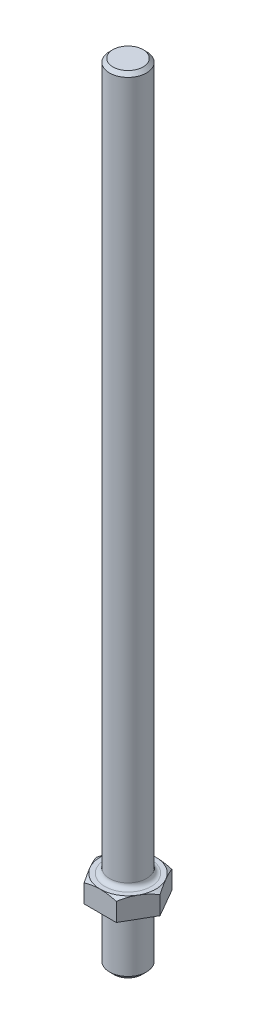
ISO-10303-21;
HEADER;
FILE_DESCRIPTION(('STEP AP214'),'2;1');
FILE_NAME('part.step','',(''),(''),'','','');
FILE_SCHEMA(('AUTOMOTIVE_DESIGN { 1 0 10303 214 1 1 1 1 }'));
ENDSEC;
DATA;
#1=APPLICATION_CONTEXT('core data for automotive mechanical design processes');
#2=APPLICATION_PROTOCOL_DEFINITION('international standard','automotive_design',2000,#1);
#3=PRODUCT_CONTEXT('',#1,'mechanical');
#4=PRODUCT('Part','Part','',(#3));
#5=PRODUCT_RELATED_PRODUCT_CATEGORY('part','',(#4));
#6=PRODUCT_DEFINITION_FORMATION('','',#4);
#7=PRODUCT_DEFINITION_CONTEXT('part definition',#1,'design');
#8=PRODUCT_DEFINITION('design','',#6,#7);
#9=PRODUCT_DEFINITION_SHAPE('','',#8);
#10=(LENGTH_UNIT() NAMED_UNIT(*) SI_UNIT(.MILLI.,.METRE.));
#11=(NAMED_UNIT(*) PLANE_ANGLE_UNIT() SI_UNIT($,.RADIAN.));
#12=(NAMED_UNIT(*) SI_UNIT($,.STERADIAN.) SOLID_ANGLE_UNIT());
#13=UNCERTAINTY_MEASURE_WITH_UNIT(LENGTH_MEASURE(1.E-05),#10,'distance_accuracy_value','');
#14=(GEOMETRIC_REPRESENTATION_CONTEXT(3) GLOBAL_UNCERTAINTY_ASSIGNED_CONTEXT((#13)) GLOBAL_UNIT_ASSIGNED_CONTEXT((#10,
#11,#12)) REPRESENTATION_CONTEXT('',''));
#15=CARTESIAN_POINT('',(0.,0.,0.));
#16=DIRECTION('',(0.,0.,1.));
#17=DIRECTION('',(1.,0.,0.));
#18=AXIS2_PLACEMENT_3D('',#15,#16,#17);
#19=CARTESIAN_POINT('',(6.92820323027551,9.,12.));
#20=DIRECTION('',(-0.866025403784439,0.,-0.5));
#21=DIRECTION('',(-0.5,0.,0.866025403784439));
#22=AXIS2_PLACEMENT_3D('',#19,#20,#21);
#23=PLANE('',#22);
#24=CARTESIAN_POINT('',(6.92808776022167,7.92813656277552,12.0002));
#25=CARTESIAN_POINT('',(7.08038456011319,8.01605036781414,11.7364142047577));
#26=CARTESIAN_POINT('',(7.23324920067831,8.09997400244333,11.4716448806182));
#27=CARTESIAN_POINT('',(7.5402043401145,8.25873378112716,10.9399829834703));
#28=CARTESIAN_POINT('',(7.69429522451414,8.33356693632642,10.6730897427069));
#29=CARTESIAN_POINT('',(8.15905073005028,8.54298246014585,9.868109594021));
#30=CARTESIAN_POINT('',(8.47155003173405,8.66209676327715,9.32684492617491));
#31=CARTESIAN_POINT('',(8.93919090681137,8.80176893899686,8.51686717084501));
#32=CARTESIAN_POINT('',(9.09293539869504,8.84155620295956,8.25057389951863));
#33=CARTESIAN_POINT('',(9.40113622968841,8.90827663078291,7.71675440130316));
#34=CARTESIAN_POINT('',(9.55559258244174,8.93520954723223,7.44922815078262));
#35=CARTESIAN_POINT('',(9.86476279544467,8.97553140808308,6.91372963367465));
#36=CARTESIAN_POINT('',(10.0194761298182,8.98893644711768,6.64575827793128));
#37=CARTESIAN_POINT('',(10.3290461538973,9.00191690624283,6.10956726772596));
#38=CARTESIAN_POINT('',(10.4839028390257,9.00149275363727,5.84134762119196));
#39=CARTESIAN_POINT('',(10.7734076259435,8.98777998065723,5.3399106212159));
#40=CARTESIAN_POINT('',(10.908076374328,8.97616401742147,5.10665750682225));
#41=CARTESIAN_POINT('',(11.1771041340893,8.94269199112762,4.64068775826923));
#42=CARTESIAN_POINT('',(11.3114631228811,8.92083520373378,4.40797116322823));
#43=CARTESIAN_POINT('',(11.5797983456356,8.86726258345709,3.94320092395705));
#44=CARTESIAN_POINT('',(11.7137741708857,8.83553860750708,3.711147987638));
#45=CARTESIAN_POINT('',(11.9810977118116,8.76278822432956,3.24813003269502));
#46=CARTESIAN_POINT('',(12.1144453841659,8.7217611848168,3.01716508910646));
#47=CARTESIAN_POINT('',(12.5192297269844,8.58368834671819,2.31605804123633));
#48=CARTESIAN_POINT('',(12.789494193517,8.47287511166067,1.84794625372147));
#49=CARTESIAN_POINT('',(13.3259930983136,8.22137423306211,0.918702892408575));
#50=CARTESIAN_POINT('',(13.5922344058351,8.08074565734061,0.457559420707842));
#51=CARTESIAN_POINT('',(13.8565219306049,7.92813656277552,-0.000200000000003557));
#52=B_SPLINE_CURVE_WITH_KNOTS('',3,(#24,#25,#26,#27,#28,#29,#30,#31,#32,#33,#34,#35,#36,#37,#38,
#39,#40,#41,#42,#43,#44,#45,#46,#47,#48,#49,#50,#51),.UNSPECIFIED.,.F.,.F.,(4,2,2,2,2,2,2,2,2,2,
2,2,2,4),(0.,0.951004872251245,1.90232158356438,3.80900466161369,4.7389455141357,
5.6689042647761,6.59775529889866,7.52657763276931,8.33514643820579,9.1437724425275,
9.95306755799766,10.7624176939264,12.4167102786892,14.0677556316691),.UNSPECIFIED.);
#53=CARTESIAN_POINT('',(6.92820323027558,7.92820323027555,12.));
#54=VERTEX_POINT('',#53);
#55=CARTESIAN_POINT('',(10.3923048454133,9.,6.));
#56=VERTEX_POINT('',#55);
#57=EDGE_CURVE('E143',#54,#56,#52,.T.);
#58=ORIENTED_EDGE('',*,*,#57,.F.);
#59=DIRECTION('',(0.,-1.,0.));
#60=VECTOR('',#59,1.);
#61=CARTESIAN_POINT('',(6.92820323027551,9.,12.));
#62=LINE('',#61,#60);
#63=CARTESIAN_POINT('',(6.92820323027551,0.,12.));
#64=VERTEX_POINT('',#63);
#65=EDGE_CURVE('E468',#54,#64,#62,.T.);
#66=ORIENTED_EDGE('',*,*,#65,.T.);
#67=DIRECTION('',(0.5,0.,-0.866025403784439));
#68=VECTOR('',#67,1.);
#69=CARTESIAN_POINT('',(6.92820323027551,0.,12.));
#70=LINE('',#69,#68);
#71=CARTESIAN_POINT('',(13.856406460551,0.,0.));
#72=VERTEX_POINT('',#71);
#73=EDGE_CURVE('E148',#64,#72,#70,.T.);
#74=ORIENTED_EDGE('',*,*,#73,.T.);
#75=DIRECTION('',(0.,-1.,0.));
#76=VECTOR('',#75,1.);
#77=CARTESIAN_POINT('',(13.856406460551,9.,0.));
#78=LINE('',#77,#76);
#79=CARTESIAN_POINT('',(13.856406460551,7.92820323027552,0.));
#80=VERTEX_POINT('',#79);
#81=EDGE_CURVE('E152',#80,#72,#78,.T.);
#82=ORIENTED_EDGE('',*,*,#81,.F.);
#83=EDGE_CURVE('E131',#56,#80,#52,.T.);
#84=ORIENTED_EDGE('',*,*,#83,.F.);
#85=EDGE_LOOP('',(#58,#66,#74,#82,#84));
#86=FACE_BOUND('',#85,.T.);
#87=ADVANCED_FACE('F48',(#86),#23,.F.);
#88=CARTESIAN_POINT('',(13.856406460551,9.,0.));
#89=DIRECTION('',(-0.866025403784439,0.,0.5));
#90=DIRECTION('',(0.5,0.,0.866025403784439));
#91=AXIS2_PLACEMENT_3D('',#88,#89,#90);
#92=PLANE('',#91);
#93=CARTESIAN_POINT('',(13.8565219306049,7.92813656277552,0.000199999999996627));
#94=CARTESIAN_POINT('',(13.7042251307133,8.01605036781414,-0.263585795242266));
#95=CARTESIAN_POINT('',(13.5513604901482,8.09997400244333,-0.528355119381804));
#96=CARTESIAN_POINT('',(13.244405350712,8.25873378112716,-1.06001701652967));
#97=CARTESIAN_POINT('',(13.0903144663124,8.33356693632641,-1.32691025729308));
#98=CARTESIAN_POINT('',(12.6255589607763,8.54298246014585,-2.13189040597901));
#99=CARTESIAN_POINT('',(12.3130596590925,8.66209676327715,-2.67315507382511));
#100=CARTESIAN_POINT('',(11.8454187840152,8.80176893899686,-3.483132829155));
#101=CARTESIAN_POINT('',(11.6916742921315,8.84155620295955,-3.74942610048138));
#102=CARTESIAN_POINT('',(11.3834734611381,8.90827663078291,-4.28324559869685));
#103=CARTESIAN_POINT('',(11.2290171083848,8.93520954723222,-4.55077184921739));
#104=CARTESIAN_POINT('',(10.9198468953819,8.97553140808308,-5.08627036632536));
#105=CARTESIAN_POINT('',(10.7651335610083,8.98893644711768,-5.35424172206874));
#106=CARTESIAN_POINT('',(10.4555635369292,9.00191690624283,-5.89043273227405));
#107=CARTESIAN_POINT('',(10.3007068518009,9.00149275363727,-6.15865237880805));
#108=CARTESIAN_POINT('',(10.0112020648831,8.98777998065723,-6.66008937878411));
#109=CARTESIAN_POINT('',(9.87653331649856,8.97616401742147,-6.89334249317776));
#110=CARTESIAN_POINT('',(9.60750555673726,8.94269199112762,-7.35931224173078));
#111=CARTESIAN_POINT('',(9.47314656794544,8.92083520373378,-7.59202883677178));
#112=CARTESIAN_POINT('',(9.2048113451909,8.86726258345709,-8.05679907604295));
#113=CARTESIAN_POINT('',(9.07083551994085,8.83553860750708,-8.28885201236201));
#114=CARTESIAN_POINT('',(8.80351197901489,8.76278822432956,-8.75186996730499));
#115=CARTESIAN_POINT('',(8.67016430666067,8.7217611848168,-8.98283491089355));
#116=CARTESIAN_POINT('',(8.26537996384211,8.58368834671819,-9.68394195876368));
#117=CARTESIAN_POINT('',(7.99511549730957,8.47287511166067,-10.1520537462785));
#118=CARTESIAN_POINT('',(7.45861659251289,8.22137423306211,-11.0812971075914));
#119=CARTESIAN_POINT('',(7.19237528499144,8.08074565734062,-11.5424405792922));
#120=CARTESIAN_POINT('',(6.92808776022168,7.92813656277552,-12.0002));
#121=B_SPLINE_CURVE_WITH_KNOTS('',3,(#93,#94,#95,#96,#97,#98,#99,#100,#101,#102,#103,#104,#105,
#106,#107,#108,#109,#110,#111,#112,#113,#114,#115,#116,#117,#118,#119,#120),.UNSPECIFIED.,.F.,
.F.,(4,2,2,2,2,2,2,2,2,2,2,2,2,4),(0.,0.951004872251246,1.90232158356438,3.80900466161369,
4.7389455141357,5.6689042647761,6.59775529889866,7.52657763276931,8.33514643820579,
9.1437724425275,9.95306755799766,10.7624176939264,12.4167102786892,14.0677556316691),.UNSPECIFIED.);
#122=CARTESIAN_POINT('',(10.3923048454133,9.,-6.00000000000001));
#123=VERTEX_POINT('',#122);
#124=EDGE_CURVE('E133',#80,#123,#121,.T.);
#125=ORIENTED_EDGE('',*,*,#124,.F.);
#126=ORIENTED_EDGE('',*,*,#81,.T.);
#127=DIRECTION('',(-0.5,0.,-0.866025403784439));
#128=VECTOR('',#127,1.);
#129=CARTESIAN_POINT('',(13.856406460551,0.,0.));
#130=LINE('',#129,#128);
#131=CARTESIAN_POINT('',(6.92820323027551,0.,-12.));
#132=VERTEX_POINT('',#131);
#133=EDGE_CURVE('E423',#72,#132,#130,.T.);
#134=ORIENTED_EDGE('',*,*,#133,.T.);
#135=DIRECTION('',(0.,-1.,0.));
#136=VECTOR('',#135,1.);
#137=CARTESIAN_POINT('',(6.92820323027551,9.,-12.));
#138=LINE('',#137,#136);
#139=CARTESIAN_POINT('',(6.92820323027551,7.92820323027551,-12.));
#140=VERTEX_POINT('',#139);
#141=EDGE_CURVE('E419',#140,#132,#138,.T.);
#142=ORIENTED_EDGE('',*,*,#141,.F.);
#143=EDGE_CURVE('E219',#123,#140,#121,.T.);
#144=ORIENTED_EDGE('',*,*,#143,.F.);
#145=EDGE_LOOP('',(#125,#126,#134,#142,#144));
#146=FACE_BOUND('',#145,.T.);
#147=ADVANCED_FACE('F233',(#146),#92,.F.);
#148=CARTESIAN_POINT('',(6.92820323027551,9.,-12.));
#149=DIRECTION('',(0.,0.,1.));
#150=DIRECTION('',(1.,0.,0.));
#151=AXIS2_PLACEMENT_3D('',#148,#149,#150);
#152=PLANE('',#151);
#153=CARTESIAN_POINT('',(23.4511148721338,0.719052599312011,-12.));
#154=CARTESIAN_POINT('',(22.9040834325755,1.00017221424734,-12.));
#155=CARTESIAN_POINT('',(22.3562460737021,1.27973740773942,-12.));
#156=CARTESIAN_POINT('',(21.258592390583,1.83497962083802,-12.));
#157=CARTESIAN_POINT('',(20.7087760283707,2.11065656534507,-12.));
#158=CARTESIAN_POINT('',(19.605908462388,2.65778340350207,-12.));
#159=CARTESIAN_POINT('',(19.0528534161768,2.92922556537542,-12.));
#160=CARTESIAN_POINT('',(17.9439367044372,3.46634509308662,-12.));
#161=CARTESIAN_POINT('',(17.3880749988182,3.73202237628975,-12.));
#162=CARTESIAN_POINT('',(16.2438766254171,4.26990948926518,-12.));
#163=CARTESIAN_POINT('',(15.6553594397968,4.54173635588283,-12.));
#164=CARTESIAN_POINT('',(14.4737964487262,5.0753203347709,-12.));
#165=CARTESIAN_POINT('',(13.8807508752518,5.33707795876587,-12.));
#166=CARTESIAN_POINT('',(12.6894870482972,5.84746724598996,-12.));
#167=CARTESIAN_POINT('',(12.091272541246,6.0961076171757,-12.));
#168=CARTESIAN_POINT('',(10.8879123456549,6.5765997047206,-12.));
#169=CARTESIAN_POINT('',(10.2827650591856,6.80844745657929,-12.));
#170=CARTESIAN_POINT('',(9.31854575768465,7.15781426700361,-12.));
#171=CARTESIAN_POINT('',(8.96214144111964,7.28267653147502,-12.));
#172=CARTESIAN_POINT('',(8.24634093787946,7.52349175100257,-12.));
#173=CARTESIAN_POINT('',(7.88694465175436,7.63944440859162,-12.));
#174=CARTESIAN_POINT('',(6.8042034047865,7.97159314022727,-12.));
#175=CARTESIAN_POINT('',(6.07587519654984,8.17223986545784,-12.));
#176=CARTESIAN_POINT('',(4.98046653545057,8.42938459078967,-12.));
#177=CARTESIAN_POINT('',(4.61835710584797,8.50724678825196,-12.));
#178=CARTESIAN_POINT('',(3.89113456201975,8.64755603590027,-12.));
#179=CARTESIAN_POINT('',(3.5260215224823,8.71000346820183,-12.));
#180=CARTESIAN_POINT('',(2.79342308434256,8.81769777030433,-12.));
#181=CARTESIAN_POINT('',(2.42593888950866,8.8629527617237,-12.));
#182=CARTESIAN_POINT('',(1.68913647346328,8.93484014411579,-12.));
#183=CARTESIAN_POINT('',(1.31981826659577,8.96147268050614,-12.));
#184=CARTESIAN_POINT('',(0.575450335386058,8.99538917226505,-12.));
#185=CARTESIAN_POINT('',(0.200388736350191,9.00241596083249,-12.));
#186=CARTESIAN_POINT('',(-0.549561456175856,8.99611762797461,-12.));
#187=CARTESIAN_POINT('',(-0.924450049484613,8.98279248525559,-12.));
#188=CARTESIAN_POINT('',(-1.67308994238322,8.93628742747006,-12.));
#189=CARTESIAN_POINT('',(-2.0468408766296,8.90310169708508,-12.));
#190=CARTESIAN_POINT('',(-2.79219700457015,8.81804993010008,-12.));
#191=CARTESIAN_POINT('',(-3.16380214589394,8.76618343951753,-12.));
#192=CARTESIAN_POINT('',(-3.91159994724779,8.6442170856841,-12.));
#193=CARTESIAN_POINT('',(-4.28773611877871,8.5737739365097,-12.));
#194=CARTESIAN_POINT('',(-5.0367301746609,8.41717287595716,-12.));
#195=CARTESIAN_POINT('',(-5.40958775265056,8.33101351202711,-12.));
#196=CARTESIAN_POINT('',(-6.1519082722025,8.14501377820946,-12.));
#197=CARTESIAN_POINT('',(-6.52137070887855,8.04517140758101,-12.));
#198=CARTESIAN_POINT('',(-7.25690241882604,7.83374244220609,-12.));
#199=CARTESIAN_POINT('',(-7.62297167255045,7.72215577985022,-12.));
#200=CARTESIAN_POINT('',(-8.33327401582776,7.49492441366584,-12.));
#201=CARTESIAN_POINT('',(-8.67766739228375,7.37977811173899,-12.));
#202=CARTESIAN_POINT('',(-9.36377770982498,7.14175269910584,-12.));
#203=CARTESIAN_POINT('',(-9.70549454481637,7.01887328359801,-12.));
#204=CARTESIAN_POINT('',(-10.3865262716006,6.76647620348883,-12.));
#205=CARTESIAN_POINT('',(-10.7258407491014,6.63695742419179,-12.));
#206=CARTESIAN_POINT('',(-11.4022490511212,6.37223564187641,-12.));
#207=CARTESIAN_POINT('',(-11.7393428144491,6.23703248297835,-12.));
#208=CARTESIAN_POINT('',(-12.7483186345413,5.82384808809453,-12.));
#209=CARTESIAN_POINT('',(-13.4172065820877,5.53855092558795,-12.));
#210=CARTESIAN_POINT('',(-14.7485014257613,4.95349964717219,-12.));
#211=CARTESIAN_POINT('',(-15.4109089281714,4.65374689952901,-12.));
#212=CARTESIAN_POINT('',(-16.6938319237068,4.06024623937219,-12.));
#213=CARTESIAN_POINT('',(-17.3146242761407,3.76709504999826,-12.));
#214=CARTESIAN_POINT('',(-18.552531562919,3.17309936579498,-12.));
#215=CARTESIAN_POINT('',(-19.1696463813168,2.87225462996669,-12.));
#216=CARTESIAN_POINT('',(-20.3989098743308,2.26542779139215,-12.));
#217=CARTESIAN_POINT('',(-21.0110680881893,1.95946498317843,-12.));
#218=CARTESIAN_POINT('',(-21.9274269780812,1.49686969878515,-12.));
#219=CARTESIAN_POINT('',(-22.2325547016638,1.34206902386015,-12.));
#220=CARTESIAN_POINT('',(-22.8422448725106,1.03136180299334,-12.));
#221=CARTESIAN_POINT('',(-23.1468073224085,0.875455262220496,-12.));
#222=CARTESIAN_POINT('',(-23.4511148721338,0.719052599312011,-12.));
#223=B_SPLINE_CURVE_WITH_KNOTS('',3,(#153,#154,#155,#156,#157,#158,#159,#160,#161,#162,#163,
#164,#165,#166,#167,#168,#169,#170,#171,#172,#173,#174,#175,#176,#177,#178,#179,#180,#181,#182,
#183,#184,#185,#186,#187,#188,#189,#190,#191,#192,#193,#194,#195,#196,#197,#198,#199,#200,#201,
#202,#203,#204,#205,#206,#207,#208,#209,#210,#211,#212,#213,#214,#215,#216,#217,#218,#219,#220,
#221,#222),.UNSPECIFIED.,.F.,.F.,(4,2,2,2,2,2,2,2,2,2,2,2,2,2,2,2,2,2,2,2,2,2,2,2,2,2,2,2,2,2,2,
2,2,2,4),(0.,1.84512066690536,3.69027692266922,5.53848006121911,7.38670967473597,
9.33141983733429,11.2760310377515,13.2193346196501,15.1630955026935,16.2959127191941,
17.4287677409028,19.693100552511,20.8039944947268,21.9148608963039,23.0252018759809,
24.1355341852138,25.2603636560478,26.3851943037628,27.510354470983,28.6355419838534,
29.7831890399153,30.9309422196453,32.0788634042365,33.2267911975288,34.3160851433029,
35.405422050641,36.4949424517247,37.5844927496589,39.7657996004199,41.9469003874126,
44.0064173416702,46.0659988891327,48.1190556796251,49.1455019600748,50.1719434459344),.UNSPECIFIED.);
#224=CARTESIAN_POINT('',(0.,9.,-12.));
#225=VERTEX_POINT('',#224);
#226=EDGE_CURVE('E226',#140,#225,#223,.T.);
#227=ORIENTED_EDGE('',*,*,#226,.F.);
#228=ORIENTED_EDGE('',*,*,#141,.T.);
#229=DIRECTION('',(-1.,0.,0.));
#230=VECTOR('',#229,1.);
#231=CARTESIAN_POINT('',(6.92820323027551,0.,-12.));
#232=LINE('',#231,#230);
#233=CARTESIAN_POINT('',(-6.92820323027552,0.,-12.));
#234=VERTEX_POINT('',#233);
#235=EDGE_CURVE('E454',#132,#234,#232,.T.);
#236=ORIENTED_EDGE('',*,*,#235,.T.);
#237=DIRECTION('',(0.,-1.,0.));
#238=VECTOR('',#237,1.);
#239=CARTESIAN_POINT('',(-6.92820323027552,9.,-12.));
#240=LINE('',#239,#238);
#241=CARTESIAN_POINT('',(-6.92820323027552,7.92820323027551,-12.));
#242=VERTEX_POINT('',#241);
#243=EDGE_CURVE('E426',#242,#234,#240,.T.);
#244=ORIENTED_EDGE('',*,*,#243,.F.);
#245=EDGE_CURVE('E179',#225,#242,#223,.T.);
#246=ORIENTED_EDGE('',*,*,#245,.F.);
#247=EDGE_LOOP('',(#227,#228,#236,#244,#246));
#248=FACE_BOUND('',#247,.T.);
#249=ADVANCED_FACE('F236',(#248),#152,.F.);
#250=CARTESIAN_POINT('',(-6.92820323027552,9.,-12.));
#251=DIRECTION('',(0.866025403784439,0.,0.5));
#252=DIRECTION('',(0.5,0.,-0.866025403784439));
#253=AXIS2_PLACEMENT_3D('',#250,#251,#252);
#254=PLANE('',#253);
#255=CARTESIAN_POINT('',(-6.92808776022168,7.92813656277552,-12.0002));
#256=CARTESIAN_POINT('',(-7.0803845601132,8.01605036781414,-11.7364142047577));
#257=CARTESIAN_POINT('',(-7.23324920067832,8.09997400244333,-11.4716448806182));
#258=CARTESIAN_POINT('',(-7.5402043401145,8.25873378112716,-10.9399829834703));
#259=CARTESIAN_POINT('',(-7.69429522451415,8.33356693632642,-10.6730897427069));
#260=CARTESIAN_POINT('',(-8.15905073005028,8.54298246014585,-9.86810959402099));
#261=CARTESIAN_POINT('',(-8.47155003173405,8.66209676327715,-9.3268449261749));
#262=CARTESIAN_POINT('',(-8.93919090681138,8.80176893899685,-8.51686717084501));
#263=CARTESIAN_POINT('',(-9.09293539869505,8.84155620295955,-8.25057389951863));
#264=CARTESIAN_POINT('',(-9.40113622968842,8.90827663078291,-7.71675440130316));
#265=CARTESIAN_POINT('',(-9.55559258244174,8.93520954723222,-7.44922815078262));
#266=CARTESIAN_POINT('',(-9.86476279544468,8.97553140808308,-6.91372963367465));
#267=CARTESIAN_POINT('',(-10.0194761298182,8.98893644711768,-6.64575827793127));
#268=CARTESIAN_POINT('',(-10.3290461538973,9.00191690624283,-6.10956726772596));
#269=CARTESIAN_POINT('',(-10.4839028390257,9.00149275363727,-5.84134762119196));
#270=CARTESIAN_POINT('',(-10.7734076259435,8.98777998065723,-5.33991062121589));
#271=CARTESIAN_POINT('',(-10.908076374328,8.97616401742147,-5.10665750682224));
#272=CARTESIAN_POINT('',(-11.1771041340893,8.94269199112762,-4.64068775826923));
#273=CARTESIAN_POINT('',(-11.3114631228811,8.92083520373378,-4.40797116322823));
#274=CARTESIAN_POINT('',(-11.5797983456356,8.86726258345709,-3.94320092395705));
#275=CARTESIAN_POINT('',(-11.7137741708857,8.83553860750707,-3.71114798763799));
#276=CARTESIAN_POINT('',(-11.9810977118116,8.76278822432956,-3.24813003269502));
#277=CARTESIAN_POINT('',(-12.1144453841659,8.7217611848168,-3.01716508910646));
#278=CARTESIAN_POINT('',(-12.5192297269844,8.5836883467182,-2.31605804123633));
#279=CARTESIAN_POINT('',(-12.789494193517,8.47287511166067,-1.84794625372147));
#280=CARTESIAN_POINT('',(-13.3259930983136,8.22137423306211,-0.918702892408575));
#281=CARTESIAN_POINT('',(-13.5922344058351,8.08074565734061,-0.457559420707844));
#282=CARTESIAN_POINT('',(-13.8565219306049,7.92813656277552,0.000200000000000469));
#283=B_SPLINE_CURVE_WITH_KNOTS('',3,(#255,#256,#257,#258,#259,#260,#261,#262,#263,#264,#265,
#266,#267,#268,#269,#270,#271,#272,#273,#274,#275,#276,#277,#278,#279,#280,#281,#282),
.UNSPECIFIED.,.F.,.F.,(4,2,2,2,2,2,2,2,2,2,2,2,2,4),(0.,0.951004872251245,1.90232158356437,
3.80900466161369,4.73894551413571,5.6689042647761,6.59775529889866,7.52657763276931,
8.33514643820579,9.1437724425275,9.95306755799766,10.7624176939264,12.4167102786892,
14.0677556316691),.UNSPECIFIED.);
#284=CARTESIAN_POINT('',(-10.3923048454133,9.,-6.));
#285=VERTEX_POINT('',#284);
#286=EDGE_CURVE('E176',#242,#285,#283,.T.);
#287=ORIENTED_EDGE('',*,*,#286,.F.);
#288=ORIENTED_EDGE('',*,*,#243,.T.);
#289=DIRECTION('',(-0.5,0.,0.866025403784439));
#290=VECTOR('',#289,1.);
#291=CARTESIAN_POINT('',(-6.92820323027552,0.,-12.));
#292=LINE('',#291,#290);
#293=CARTESIAN_POINT('',(-13.856406460551,0.,0.));
#294=VERTEX_POINT('',#293);
#295=EDGE_CURVE('E459',#234,#294,#292,.T.);
#296=ORIENTED_EDGE('',*,*,#295,.T.);
#297=DIRECTION('',(0.,-1.,0.));
#298=VECTOR('',#297,1.);
#299=CARTESIAN_POINT('',(-13.856406460551,9.,0.));
#300=LINE('',#299,#298);
#301=CARTESIAN_POINT('',(-13.856406460551,7.92820323027552,0.));
#302=VERTEX_POINT('',#301);
#303=EDGE_CURVE('E187',#302,#294,#300,.T.);
#304=ORIENTED_EDGE('',*,*,#303,.F.);
#305=EDGE_CURVE('E172',#285,#302,#283,.T.);
#306=ORIENTED_EDGE('',*,*,#305,.F.);
#307=EDGE_LOOP('',(#287,#288,#296,#304,#306));
#308=FACE_BOUND('',#307,.T.);
#309=ADVANCED_FACE('F185',(#308),#254,.F.);
#310=CARTESIAN_POINT('',(-13.856406460551,9.,0.));
#311=DIRECTION('',(0.866025403784438,0.,-0.5));
#312=DIRECTION('',(-0.5,0.,-0.866025403784438));
#313=AXIS2_PLACEMENT_3D('',#310,#311,#312);
#314=PLANE('',#313);
#315=CARTESIAN_POINT('',(-13.8565219306049,7.92813656277552,-0.000199999999998361));
#316=CARTESIAN_POINT('',(-13.7042251307133,8.01605036781414,0.263585795242263));
#317=CARTESIAN_POINT('',(-13.5513604901482,8.09997400244333,0.528355119381802));
#318=CARTESIAN_POINT('',(-13.244405350712,8.25873378112716,1.06001701652966));
#319=CARTESIAN_POINT('',(-13.0903144663124,8.33356693632642,1.32691025729307));
#320=CARTESIAN_POINT('',(-12.6255589607763,8.54298246014585,2.13189040597901));
#321=CARTESIAN_POINT('',(-12.3130596590925,8.66209676327715,2.6731550738251));
#322=CARTESIAN_POINT('',(-11.8454187840152,8.80176893899686,3.483132829155));
#323=CARTESIAN_POINT('',(-11.6916742921315,8.84155620295956,3.74942610048138));
#324=CARTESIAN_POINT('',(-11.3834734611381,8.90827663078291,4.28324559869684));
#325=CARTESIAN_POINT('',(-11.2290171083848,8.93520954723223,4.55077184921739));
#326=CARTESIAN_POINT('',(-10.9198468953819,8.97553140808308,5.08627036632535));
#327=CARTESIAN_POINT('',(-10.7651335610083,8.98893644711768,5.35424172206873));
#328=CARTESIAN_POINT('',(-10.4555635369292,9.00191690624283,5.89043273227404));
#329=CARTESIAN_POINT('',(-10.3007068518009,9.00149275363727,6.15865237880804));
#330=CARTESIAN_POINT('',(-10.0112020648831,8.98777998065723,6.66008937878411));
#331=CARTESIAN_POINT('',(-9.87653331649856,8.97616401742147,6.89334249317776));
#332=CARTESIAN_POINT('',(-9.60750555673725,8.94269199112762,7.35931224173077));
#333=CARTESIAN_POINT('',(-9.47314656794544,8.92083520373378,7.59202883677178));
#334=CARTESIAN_POINT('',(-9.2048113451909,8.86726258345709,8.05679907604295));
#335=CARTESIAN_POINT('',(-9.07083551994085,8.83553860750708,8.28885201236201));
#336=CARTESIAN_POINT('',(-8.80351197901489,8.76278822432956,8.75186996730499));
#337=CARTESIAN_POINT('',(-8.67016430666066,8.7217611848168,8.98283491089355));
#338=CARTESIAN_POINT('',(-8.2653799638421,8.5836883467182,9.68394195876367));
#339=CARTESIAN_POINT('',(-7.99511549730956,8.47287511166067,10.1520537462785));
#340=CARTESIAN_POINT('',(-7.45861659251289,8.22137423306211,11.0812971075914));
#341=CARTESIAN_POINT('',(-7.19237528499143,8.08074565734061,11.5424405792922));
#342=CARTESIAN_POINT('',(-6.92808776022167,7.92813656277552,12.0002));
#343=B_SPLINE_CURVE_WITH_KNOTS('',3,(#315,#316,#317,#318,#319,#320,#321,#322,#323,#324,#325,
#326,#327,#328,#329,#330,#331,#332,#333,#334,#335,#336,#337,#338,#339,#340,#341,#342),
.UNSPECIFIED.,.F.,.F.,(4,2,2,2,2,2,2,2,2,2,2,2,2,4),(0.,0.951004872251246,1.90232158356438,
3.80900466161369,4.73894551413571,5.6689042647761,6.59775529889866,7.52657763276931,
8.33514643820579,9.1437724425275,9.95306755799766,10.7624176939264,12.4167102786892,
14.0677556316691),.UNSPECIFIED.);
#344=CARTESIAN_POINT('',(-10.3923048454133,9.,6.00000000000001));
#345=VERTEX_POINT('',#344);
#346=EDGE_CURVE('E161',#302,#345,#343,.T.);
#347=ORIENTED_EDGE('',*,*,#346,.F.);
#348=ORIENTED_EDGE('',*,*,#303,.T.);
#349=DIRECTION('',(0.5,0.,0.866025403784438));
#350=VECTOR('',#349,1.);
#351=CARTESIAN_POINT('',(-13.856406460551,0.,0.));
#352=LINE('',#351,#350);
#353=CARTESIAN_POINT('',(-6.92820323027551,0.,12.));
#354=VERTEX_POINT('',#353);
#355=EDGE_CURVE('E462',#294,#354,#352,.T.);
#356=ORIENTED_EDGE('',*,*,#355,.T.);
#357=DIRECTION('',(0.,-1.,0.));
#358=VECTOR('',#357,1.);
#359=CARTESIAN_POINT('',(-6.92820323027551,9.,12.));
#360=LINE('',#359,#358);
#361=CARTESIAN_POINT('',(-6.92820323027551,7.92820323027552,12.));
#362=VERTEX_POINT('',#361);
#363=EDGE_CURVE('E471',#362,#354,#360,.T.);
#364=ORIENTED_EDGE('',*,*,#363,.F.);
#365=EDGE_CURVE('E159',#345,#362,#343,.T.);
#366=ORIENTED_EDGE('',*,*,#365,.F.);
#367=EDGE_LOOP('',(#347,#348,#356,#364,#366));
#368=FACE_BOUND('',#367,.T.);
#369=ADVANCED_FACE('F378',(#368),#314,.F.);
#370=CARTESIAN_POINT('',(-6.92820323027551,9.,12.));
#371=DIRECTION('',(0.,0.,-1.));
#372=DIRECTION('',(-1.,0.,0.));
#373=AXIS2_PLACEMENT_3D('',#370,#371,#372);
#374=PLANE('',#373);
#375=CARTESIAN_POINT('',(-23.4511148721338,0.71905259931202,12.));
#376=CARTESIAN_POINT('',(-22.9040834325755,1.00017221424735,12.));
#377=CARTESIAN_POINT('',(-22.3562460737021,1.27973740773943,12.));
#378=CARTESIAN_POINT('',(-21.258592390583,1.83497962083803,12.));
#379=CARTESIAN_POINT('',(-20.7087760283707,2.11065656534508,12.));
#380=CARTESIAN_POINT('',(-19.605908462388,2.65778340350207,12.));
#381=CARTESIAN_POINT('',(-19.0528534161768,2.92922556537543,12.));
#382=CARTESIAN_POINT('',(-17.9439367044372,3.46634509308662,12.));
#383=CARTESIAN_POINT('',(-17.3880749988182,3.73202237628975,12.));
#384=CARTESIAN_POINT('',(-16.2438766254171,4.26990948926518,12.));
#385=CARTESIAN_POINT('',(-15.6553594397968,4.54173635588284,12.));
#386=CARTESIAN_POINT('',(-14.4737964487262,5.0753203347709,12.));
#387=CARTESIAN_POINT('',(-13.8807508752518,5.33707795876587,12.));
#388=CARTESIAN_POINT('',(-12.6894870482972,5.84746724598996,12.));
#389=CARTESIAN_POINT('',(-12.091272541246,6.09610761717571,12.));
#390=CARTESIAN_POINT('',(-10.8879123456549,6.57659970472061,12.));
#391=CARTESIAN_POINT('',(-10.2827650591856,6.80844745657929,12.));
#392=CARTESIAN_POINT('',(-9.31854575768465,7.15781426700361,12.));
#393=CARTESIAN_POINT('',(-8.96214144111963,7.28267653147502,12.));
#394=CARTESIAN_POINT('',(-8.24634093787946,7.52349175100257,12.));
#395=CARTESIAN_POINT('',(-7.88694465175435,7.63944440859162,12.));
#396=CARTESIAN_POINT('',(-6.80420340478649,7.97159314022727,12.));
#397=CARTESIAN_POINT('',(-6.07587519654983,8.17223986545785,12.));
#398=CARTESIAN_POINT('',(-4.98046653545056,8.42938459078967,12.));
#399=CARTESIAN_POINT('',(-4.61835710584796,8.50724678825197,12.));
#400=CARTESIAN_POINT('',(-3.89113456201974,8.64755603590027,12.));
#401=CARTESIAN_POINT('',(-3.52602152248229,8.71000346820183,12.));
#402=CARTESIAN_POINT('',(-2.79342308434255,8.81769777030433,12.));
#403=CARTESIAN_POINT('',(-2.42593888950866,8.8629527617237,12.));
#404=CARTESIAN_POINT('',(-1.68913647346328,8.93484014411579,12.));
#405=CARTESIAN_POINT('',(-1.31981826659576,8.96147268050615,12.));
#406=CARTESIAN_POINT('',(-0.575450335386052,8.99538917226505,12.));
#407=CARTESIAN_POINT('',(-0.200388736350185,9.00241596083249,12.));
#408=CARTESIAN_POINT('',(0.549561456175861,8.99611762797461,12.));
#409=CARTESIAN_POINT('',(0.924450049484618,8.98279248525559,12.));
#410=CARTESIAN_POINT('',(1.67308994238322,8.93628742747006,12.));
#411=CARTESIAN_POINT('',(2.0468408766296,8.90310169708508,12.));
#412=CARTESIAN_POINT('',(2.79219700457015,8.81804993010008,12.));
#413=CARTESIAN_POINT('',(3.16380214589394,8.76618343951753,12.));
#414=CARTESIAN_POINT('',(3.9115999472478,8.6442170856841,12.));
#415=CARTESIAN_POINT('',(4.28773611877871,8.5737739365097,12.));
#416=CARTESIAN_POINT('',(5.03673017466091,8.41717287595716,12.));
#417=CARTESIAN_POINT('',(5.40958775265057,8.3310135120271,12.));
#418=CARTESIAN_POINT('',(6.1519082722025,8.14501377820945,12.));
#419=CARTESIAN_POINT('',(6.52137070887855,8.04517140758101,12.));
#420=CARTESIAN_POINT('',(7.25690241882605,7.83374244220609,12.));
#421=CARTESIAN_POINT('',(7.62297167255045,7.72215577985021,12.));
#422=CARTESIAN_POINT('',(8.33327401582777,7.49492441366584,12.));
#423=CARTESIAN_POINT('',(8.67766739228375,7.37977811173899,12.));
#424=CARTESIAN_POINT('',(9.36377770982498,7.14175269910583,12.));
#425=CARTESIAN_POINT('',(9.70549454481637,7.01887328359801,12.));
#426=CARTESIAN_POINT('',(10.3865262716006,6.76647620348883,12.));
#427=CARTESIAN_POINT('',(10.7258407491014,6.63695742419179,12.));
#428=CARTESIAN_POINT('',(11.4022490511212,6.37223564187641,12.));
#429=CARTESIAN_POINT('',(11.7393428144491,6.23703248297834,12.));
#430=CARTESIAN_POINT('',(12.7483186345413,5.82384808809452,12.));
#431=CARTESIAN_POINT('',(13.4172065820877,5.53855092558795,12.));
#432=CARTESIAN_POINT('',(14.7485014257613,4.95349964717218,12.));
#433=CARTESIAN_POINT('',(15.4109089281714,4.653746899529,12.));
#434=CARTESIAN_POINT('',(16.6938319237068,4.06024623937219,12.));
#435=CARTESIAN_POINT('',(17.3146242761407,3.76709504999826,12.));
#436=CARTESIAN_POINT('',(18.552531562919,3.17309936579498,12.));
#437=CARTESIAN_POINT('',(19.1696463813168,2.87225462996669,12.));
#438=CARTESIAN_POINT('',(20.3989098743308,2.26542779139215,12.));
#439=CARTESIAN_POINT('',(21.0110680881893,1.95946498317843,12.));
#440=CARTESIAN_POINT('',(21.9274269780812,1.49686969878516,12.));
#441=CARTESIAN_POINT('',(22.2325547016638,1.34206902386015,12.));
#442=CARTESIAN_POINT('',(22.8422448725106,1.03136180299334,12.));
#443=CARTESIAN_POINT('',(23.1468073224085,0.875455262220499,12.));
#444=CARTESIAN_POINT('',(23.4511148721338,0.719052599312015,12.));
#445=B_SPLINE_CURVE_WITH_KNOTS('',3,(#375,#376,#377,#378,#379,#380,#381,#382,#383,#384,#385,
#386,#387,#388,#389,#390,#391,#392,#393,#394,#395,#396,#397,#398,#399,#400,#401,#402,#403,#404,
#405,#406,#407,#408,#409,#410,#411,#412,#413,#414,#415,#416,#417,#418,#419,#420,#421,#422,#423,
#424,#425,#426,#427,#428,#429,#430,#431,#432,#433,#434,#435,#436,#437,#438,#439,#440,#441,#442,
#443,#444),.UNSPECIFIED.,.F.,.F.,(4,2,2,2,2,2,2,2,2,2,2,2,2,2,2,2,2,2,2,2,2,2,2,2,2,2,2,2,2,2,2,
2,2,2,4),(0.,1.84512066690535,3.69027692266921,5.5384800612191,7.38670967473596,
9.33141983733428,11.2760310377515,13.21933461965,15.1630955026935,16.2959127191941,
17.4287677409028,19.693100552511,20.8039944947268,21.9148608963039,23.0252018759809,
24.1355341852138,25.2603636560478,26.3851943037628,27.510354470983,28.6355419838534,
29.7831890399153,30.9309422196452,32.0788634042364,33.2267911975287,34.3160851433029,
35.405422050641,36.4949424517247,37.5844927496589,39.7657996004199,41.9469003874126,
44.0064173416702,46.0659988891327,48.1190556796251,49.1455019600748,50.1719434459344),.UNSPECIFIED.);
#446=CARTESIAN_POINT('',(0.,9.,12.));
#447=VERTEX_POINT('',#446);
#448=EDGE_CURVE('E13',#362,#447,#445,.T.);
#449=ORIENTED_EDGE('',*,*,#448,.F.);
#450=ORIENTED_EDGE('',*,*,#363,.T.);
#451=DIRECTION('',(1.,0.,0.));
#452=VECTOR('',#451,1.);
#453=CARTESIAN_POINT('',(-6.92820323027551,0.,12.));
#454=LINE('',#453,#452);
#455=EDGE_CURVE('E451',#354,#64,#454,.T.);
#456=ORIENTED_EDGE('',*,*,#455,.T.);
#457=ORIENTED_EDGE('',*,*,#65,.F.);
#458=EDGE_CURVE('E53',#447,#54,#445,.T.);
#459=ORIENTED_EDGE('',*,*,#458,.F.);
#460=EDGE_LOOP('',(#449,#450,#456,#457,#459));
#461=FACE_BOUND('',#460,.T.);
#462=ADVANCED_FACE('F373',(#461),#374,.F.);
#463=CARTESIAN_POINT('',(0.,0.,0.));
#464=DIRECTION('',(0.,1.,0.));
#465=DIRECTION('',(0.,0.,1.));
#466=AXIS2_PLACEMENT_3D('',#463,#464,#465);
#467=PLANE('',#466);
#468=CARTESIAN_POINT('',(0.,0.,0.));
#469=DIRECTION('',(0.,1.,0.));
#470=DIRECTION('',(0.,0.,1.));
#471=AXIS2_PLACEMENT_3D('',#468,#469,#470);
#472=CIRCLE('',#471,10.);
#473=CARTESIAN_POINT('',(0.,0.,10.));
#474=VERTEX_POINT('',#473);
#475=EDGE_CURVE('E286',#474,#474,#472,.T.);
#476=ORIENTED_EDGE('',*,*,#475,.T.);
#477=EDGE_LOOP('',(#476));
#478=FACE_BOUND('',#477,.T.);
#479=ORIENTED_EDGE('',*,*,#73,.F.);
#480=ORIENTED_EDGE('',*,*,#455,.F.);
#481=ORIENTED_EDGE('',*,*,#355,.F.);
#482=ORIENTED_EDGE('',*,*,#295,.F.);
#483=ORIENTED_EDGE('',*,*,#235,.F.);
#484=ORIENTED_EDGE('',*,*,#133,.F.);
#485=EDGE_LOOP('',(#479,#480,#481,#482,#483,#484));
#486=FACE_BOUND('',#485,.T.);
#487=ADVANCED_FACE('F250',(#478,#486),#467,.F.);
#488=CARTESIAN_POINT('',(0.,-26.,0.));
#489=DIRECTION('',(0.,1.,0.));
#490=DIRECTION('',(0.,0.,1.));
#491=AXIS2_PLACEMENT_3D('',#488,#489,#490);
#492=PLANE('',#491);
#493=CARTESIAN_POINT('',(0.,-26.,0.));
#494=DIRECTION('',(0.,1.,0.));
#495=DIRECTION('',(0.,0.,1.));
#496=AXIS2_PLACEMENT_3D('',#493,#494,#495);
#497=CIRCLE('',#496,5.99999999999984);
#498=CARTESIAN_POINT('',(0.,-26.,5.99999999999984));
#499=VERTEX_POINT('',#498);
#500=EDGE_CURVE('E273',#499,#499,#497,.F.);
#501=ORIENTED_EDGE('',*,*,#500,.T.);
#502=EDGE_LOOP('',(#501));
#503=FACE_BOUND('',#502,.T.);
#504=ADVANCED_FACE('F246',(#503),#492,.F.);
#505=CARTESIAN_POINT('',(0.,-26.,0.));
#506=DIRECTION('',(0.,1.,0.));
#507=DIRECTION('',(0.,0.,1.));
#508=AXIS2_PLACEMENT_3D('',#505,#506,#507);
#509=CYLINDRICAL_SURFACE('',#508,8.);
#510=CARTESIAN_POINT('',(0.,-23.9999999999998,0.));
#511=DIRECTION('',(0.,1.,0.));
#512=DIRECTION('',(0.,0.,1.));
#513=AXIS2_PLACEMENT_3D('',#510,#511,#512);
#514=CIRCLE('',#513,8.);
#515=CARTESIAN_POINT('',(0.,-23.9999999999998,8.));
#516=VERTEX_POINT('',#515);
#517=EDGE_CURVE('E276',#516,#516,#514,.T.);
#518=CARTESIAN_POINT('',(0.,-2.,0.));
#519=DIRECTION('',(0.,1.,0.));
#520=DIRECTION('',(0.,0.,1.));
#521=AXIS2_PLACEMENT_3D('',#518,#519,#520);
#522=CIRCLE('',#521,8.);
#523=CARTESIAN_POINT('',(0.,-2.,8.));
#524=VERTEX_POINT('',#523);
#525=EDGE_CURVE('E279',#524,#524,#522,.F.);
#526=CARTESIAN_POINT('',(0.,-23.9999999999998,8.));
#527=CARTESIAN_POINT('',(0.,-23.7708333333332,8.));
#528=CARTESIAN_POINT('',(0.,-23.5416666666665,8.));
#529=CARTESIAN_POINT('',(0.,-23.0833333333332,8.));
#530=CARTESIAN_POINT('',(0.,-22.8541666666665,8.));
#531=CARTESIAN_POINT('',(0.,-22.3958333333332,8.));
#532=CARTESIAN_POINT('',(0.,-22.1666666666665,8.));
#533=CARTESIAN_POINT('',(0.,-21.7083333333332,8.));
#534=CARTESIAN_POINT('',(0.,-21.4791666666665,8.));
#535=CARTESIAN_POINT('',(0.,-21.0208333333332,8.));
#536=CARTESIAN_POINT('',(0.,-20.7916666666665,8.));
#537=CARTESIAN_POINT('',(0.,-20.3333333333332,8.));
#538=CARTESIAN_POINT('',(0.,-20.1041666666665,8.));
#539=CARTESIAN_POINT('',(0.,-19.6458333333332,8.));
#540=CARTESIAN_POINT('',(0.,-19.4166666666665,8.));
#541=CARTESIAN_POINT('',(0.,-18.9583333333332,8.));
#542=CARTESIAN_POINT('',(0.,-18.7291666666665,8.));
#543=CARTESIAN_POINT('',(0.,-18.2708333333332,8.));
#544=CARTESIAN_POINT('',(0.,-18.0416666666666,8.));
#545=CARTESIAN_POINT('',(0.,-17.5833333333332,8.));
#546=CARTESIAN_POINT('',(0.,-17.3541666666666,8.));
#547=CARTESIAN_POINT('',(0.,-16.8958333333332,8.));
#548=CARTESIAN_POINT('',(0.,-16.6666666666666,8.));
#549=CARTESIAN_POINT('',(0.,-16.2083333333332,8.));
#550=CARTESIAN_POINT('',(0.,-15.9791666666666,8.));
#551=CARTESIAN_POINT('',(0.,-15.5208333333332,8.));
#552=CARTESIAN_POINT('',(0.,-15.2916666666666,8.));
#553=CARTESIAN_POINT('',(0.,-14.8333333333332,8.));
#554=CARTESIAN_POINT('',(0.,-14.6041666666666,8.));
#555=CARTESIAN_POINT('',(0.,-14.1458333333332,8.));
#556=CARTESIAN_POINT('',(0.,-13.9166666666666,8.));
#557=CARTESIAN_POINT('',(0.,-13.4583333333333,8.));
#558=CARTESIAN_POINT('',(0.,-13.2291666666666,8.));
#559=CARTESIAN_POINT('',(0.,-12.7708333333333,8.));
#560=CARTESIAN_POINT('',(0.,-12.5416666666666,8.));
#561=CARTESIAN_POINT('',(0.,-12.0833333333333,8.));
#562=CARTESIAN_POINT('',(0.,-11.8541666666666,8.));
#563=CARTESIAN_POINT('',(0.,-11.3958333333333,8.));
#564=CARTESIAN_POINT('',(0.,-11.1666666666666,8.));
#565=CARTESIAN_POINT('',(0.,-10.7083333333333,8.));
#566=CARTESIAN_POINT('',(0.,-10.4791666666666,8.));
#567=CARTESIAN_POINT('',(0.,-10.0208333333333,8.));
#568=CARTESIAN_POINT('',(0.,-9.79166666666661,8.));
#569=CARTESIAN_POINT('',(0.,-9.33333333333328,8.));
#570=CARTESIAN_POINT('',(0.,-9.10416666666662,8.));
#571=CARTESIAN_POINT('',(0.,-8.64583333333329,8.));
#572=CARTESIAN_POINT('',(0.,-8.41666666666662,8.));
#573=CARTESIAN_POINT('',(0.,-7.95833333333329,8.));
#574=CARTESIAN_POINT('',(0.,-7.72916666666663,8.));
#575=CARTESIAN_POINT('',(0.,-7.2708333333333,8.));
#576=CARTESIAN_POINT('',(0.,-7.04166666666663,8.));
#577=CARTESIAN_POINT('',(0.,-6.5833333333333,8.));
#578=CARTESIAN_POINT('',(0.,-6.35416666666664,8.));
#579=CARTESIAN_POINT('',(0.,-5.89583333333331,8.));
#580=CARTESIAN_POINT('',(0.,-5.66666666666664,8.));
#581=CARTESIAN_POINT('',(0.,-5.20833333333331,8.));
#582=CARTESIAN_POINT('',(0.,-4.97916666666665,8.));
#583=CARTESIAN_POINT('',(0.,-4.52083333333332,8.));
#584=CARTESIAN_POINT('',(0.,-4.29166666666665,8.));
#585=CARTESIAN_POINT('',(0.,-3.83333333333332,8.));
#586=CARTESIAN_POINT('',(0.,-3.60416666666666,8.));
#587=CARTESIAN_POINT('',(0.,-3.14583333333333,8.));
#588=CARTESIAN_POINT('',(0.,-2.91666666666666,8.));
#589=CARTESIAN_POINT('',(0.,-2.45833333333333,8.));
#590=CARTESIAN_POINT('',(0.,-2.22916666666667,8.));
#591=CARTESIAN_POINT('',(0.,-2.,8.));
#592=B_SPLINE_CURVE_WITH_KNOTS('',3,(#526,#527,#528,#529,#530,#531,#532,#533,#534,#535,#536,
#537,#538,#539,#540,#541,#542,#543,#544,#545,#546,#547,#548,#549,#550,#551,#552,#553,#554,#555,
#556,#557,#558,#559,#560,#561,#562,#563,#564,#565,#566,#567,#568,#569,#570,#571,#572,#573,#574,
#575,#576,#577,#578,#579,#580,#581,#582,#583,#584,#585,#586,#587,#588,#589,#590,#591),
.UNSPECIFIED.,.F.,.F.,(4,2,2,2,2,2,2,2,2,2,2,2,2,2,2,2,2,2,2,2,2,2,2,2,2,2,2,2,2,2,2,2,4),(0.,
0.687499999999994,1.37499999999999,2.06249999999998,2.74999999999998,3.43749999999997,
4.12499999999997,4.81249999999996,5.49999999999996,6.18749999999995,6.87499999999995,
7.56249999999994,8.24999999999993,8.93749999999993,9.62499999999993,10.3124999999999,
10.9999999999999,11.6874999999999,12.3749999999999,13.0624999999999,13.7499999999999,
14.4374999999999,15.1249999999999,15.8124999999999,16.4999999999999,17.1874999999999,
17.8749999999999,18.5624999999999,19.2499999999999,19.9374999999999,20.6249999999998,
21.3124999999998,21.9999999999998),.UNSPECIFIED.);
#593=EDGE_CURVE('BSEAM249',#516,#524,#592,.T.);
#594=ORIENTED_EDGE('',*,*,#517,.T.);
#595=ORIENTED_EDGE('',*,*,#525,.T.);
#596=ORIENTED_EDGE('',*,*,#593,.T.);
#597=ORIENTED_EDGE('',*,*,#593,.F.);
#598=EDGE_LOOP('',(#594,#596,#595,#597));
#599=FACE_BOUND('',#598,.T.);
#600=ADVANCED_FACE('F249',(#599),#509,.T.);
#601=CARTESIAN_POINT('',(0.,-2.,0.));
#602=DIRECTION('',(0.,1.,0.));
#603=DIRECTION('',(0.,0.,1.));
#604=AXIS2_PLACEMENT_3D('',#601,#602,#603);
#605=TOROIDAL_SURFACE('',#604,10.,2.);
#606=ORIENTED_EDGE('',*,*,#525,.F.);
#607=EDGE_LOOP('',(#606));
#608=FACE_BOUND('',#607,.T.);
#609=ORIENTED_EDGE('',*,*,#475,.F.);
#610=EDGE_LOOP('',(#609));
#611=FACE_BOUND('',#610,.T.);
#612=ADVANCED_FACE('F260',(#608,#611),#605,.F.);
#613=CARTESIAN_POINT('',(0.,-23.9999999999998,0.));
#614=DIRECTION('',(0.,1.,0.));
#615=DIRECTION('',(0.,0.,1.));
#616=AXIS2_PLACEMENT_3D('',#613,#614,#615);
#617=CONICAL_SURFACE('',#616,8.,0.785398163397449);
#618=ORIENTED_EDGE('',*,*,#500,.F.);
#619=EDGE_LOOP('',(#618));
#620=FACE_BOUND('',#619,.T.);
#621=ORIENTED_EDGE('',*,*,#517,.F.);
#622=EDGE_LOOP('',(#621));
#623=FACE_BOUND('',#622,.T.);
#624=ADVANCED_FACE('F212',(#620,#623),#617,.T.);
#625=CARTESIAN_POINT('',(0.,9.,0.));
#626=DIRECTION('',(0.,-1.,0.));
#627=DIRECTION('',(0.,0.,1.));
#628=AXIS2_PLACEMENT_3D('',#625,#626,#627);
#629=CONICAL_SURFACE('',#628,12.,1.0471975511966);
#630=ORIENTED_EDGE('',*,*,#57,.T.);
#631=CARTESIAN_POINT('',(0.,9.,0.));
#632=DIRECTION('',(0.,1.,0.));
#633=DIRECTION('',(0.,0.,1.));
#634=AXIS2_PLACEMENT_3D('',#631,#632,#633);
#635=CIRCLE('',#634,12.);
#636=EDGE_CURVE('E138',#447,#56,#635,.T.);
#637=ORIENTED_EDGE('',*,*,#636,.F.);
#638=ORIENTED_EDGE('',*,*,#458,.T.);
#639=EDGE_LOOP('',(#630,#637,#638));
#640=FACE_BOUND('',#639,.T.);
#641=ADVANCED_FACE('F144',(#640),#629,.T.);
#642=ORIENTED_EDGE('',*,*,#365,.T.);
#643=ORIENTED_EDGE('',*,*,#448,.T.);
#644=EDGE_CURVE('E157',#345,#447,#635,.T.);
#645=ORIENTED_EDGE('',*,*,#644,.F.);
#646=EDGE_LOOP('',(#642,#643,#645));
#647=FACE_BOUND('',#646,.T.);
#648=ADVANCED_FACE('F211',(#647),#629,.T.);
#649=ORIENTED_EDGE('',*,*,#305,.T.);
#650=ORIENTED_EDGE('',*,*,#346,.T.);
#651=EDGE_CURVE('E164',#285,#345,#635,.T.);
#652=ORIENTED_EDGE('',*,*,#651,.F.);
#653=EDGE_LOOP('',(#649,#650,#652));
#654=FACE_BOUND('',#653,.T.);
#655=ADVANCED_FACE('F170',(#654),#629,.T.);
#656=ORIENTED_EDGE('',*,*,#245,.T.);
#657=ORIENTED_EDGE('',*,*,#286,.T.);
#658=EDGE_CURVE('E79',#225,#285,#635,.T.);
#659=ORIENTED_EDGE('',*,*,#658,.F.);
#660=EDGE_LOOP('',(#656,#657,#659));
#661=FACE_BOUND('',#660,.T.);
#662=ADVANCED_FACE('F177',(#661),#629,.T.);
#663=ORIENTED_EDGE('',*,*,#143,.T.);
#664=ORIENTED_EDGE('',*,*,#226,.T.);
#665=EDGE_CURVE('E71',#123,#225,#635,.T.);
#666=ORIENTED_EDGE('',*,*,#665,.F.);
#667=EDGE_LOOP('',(#663,#664,#666));
#668=FACE_BOUND('',#667,.T.);
#669=ADVANCED_FACE('F335',(#668),#629,.T.);
#670=ORIENTED_EDGE('',*,*,#83,.T.);
#671=ORIENTED_EDGE('',*,*,#124,.T.);
#672=EDGE_CURVE('E127',#56,#123,#635,.T.);
#673=ORIENTED_EDGE('',*,*,#672,.F.);
#674=EDGE_LOOP('',(#670,#671,#673));
#675=FACE_BOUND('',#674,.T.);
#676=ADVANCED_FACE('F129',(#675),#629,.T.);
#677=CARTESIAN_POINT('',(0.,314.,0.));
#678=DIRECTION('',(0.,1.,0.));
#679=DIRECTION('',(0.,0.,1.));
#680=AXIS2_PLACEMENT_3D('',#677,#678,#679);
#681=PLANE('',#680);
#682=CARTESIAN_POINT('',(0.,314.,0.));
#683=DIRECTION('',(0.,1.,0.));
#684=DIRECTION('',(0.,0.,1.));
#685=AXIS2_PLACEMENT_3D('',#682,#683,#684);
#686=CIRCLE('',#685,6.50000000000003);
#687=CARTESIAN_POINT('',(0.,314.,6.50000000000003));
#688=VERTEX_POINT('',#687);
#689=EDGE_CURVE('E283',#688,#688,#686,.T.);
#690=ORIENTED_EDGE('',*,*,#689,.T.);
#691=EDGE_LOOP('',(#690));
#692=FACE_BOUND('',#691,.T.);
#693=ADVANCED_FACE('F242',(#692),#681,.T.);
#694=CARTESIAN_POINT('',(0.,314.,0.));
#695=DIRECTION('',(0.,-1.,0.));
#696=DIRECTION('',(0.,0.,-1.));
#697=AXIS2_PLACEMENT_3D('',#694,#695,#696);
#698=CONICAL_SURFACE('',#697,6.50000000000003,0.785398163397493);
#699=CARTESIAN_POINT('',(0.,312.5,0.));
#700=DIRECTION('',(0.,1.,0.));
#701=DIRECTION('',(0.,0.,1.));
#702=AXIS2_PLACEMENT_3D('',#699,#700,#701);
#703=CIRCLE('',#702,8.);
#704=CARTESIAN_POINT('',(0.,312.5,8.));
#705=VERTEX_POINT('',#704);
#706=EDGE_CURVE('E292',#705,#705,#703,.F.);
#707=ORIENTED_EDGE('',*,*,#706,.F.);
#708=EDGE_LOOP('',(#707));
#709=FACE_BOUND('',#708,.T.);
#710=ORIENTED_EDGE('',*,*,#689,.F.);
#711=EDGE_LOOP('',(#710));
#712=FACE_BOUND('',#711,.T.);
#713=ADVANCED_FACE('F51',(#709,#712),#698,.T.);
#714=CARTESIAN_POINT('',(0.,11.,0.));
#715=DIRECTION('',(0.,1.,0.));
#716=DIRECTION('',(0.,0.,1.));
#717=AXIS2_PLACEMENT_3D('',#714,#715,#716);
#718=CIRCLE('',#717,8.);
#719=CARTESIAN_POINT('',(0.,11.,8.));
#720=VERTEX_POINT('',#719);
#721=EDGE_CURVE('E438',#720,#720,#718,.T.);
#722=CARTESIAN_POINT('',(0.,312.5,8.));
#723=CARTESIAN_POINT('',(0.,309.359375,8.));
#724=CARTESIAN_POINT('',(0.,306.21875,8.));
#725=CARTESIAN_POINT('',(0.,299.9375,8.));
#726=CARTESIAN_POINT('',(0.,296.796875,8.));
#727=CARTESIAN_POINT('',(0.,290.515625,8.));
#728=CARTESIAN_POINT('',(0.,287.375,8.));
#729=CARTESIAN_POINT('',(0.,281.09375,8.));
#730=CARTESIAN_POINT('',(0.,277.953125,8.));
#731=CARTESIAN_POINT('',(0.,271.671875,8.));
#732=CARTESIAN_POINT('',(0.,268.53125,8.));
#733=CARTESIAN_POINT('',(0.,262.25,8.));
#734=CARTESIAN_POINT('',(0.,259.109375,8.));
#735=CARTESIAN_POINT('',(0.,252.828125,8.));
#736=CARTESIAN_POINT('',(0.,249.6875,8.));
#737=CARTESIAN_POINT('',(0.,243.40625,8.));
#738=CARTESIAN_POINT('',(0.,240.265625,8.));
#739=CARTESIAN_POINT('',(0.,233.984375,8.));
#740=CARTESIAN_POINT('',(0.,230.84375,8.));
#741=CARTESIAN_POINT('',(0.,224.5625,8.));
#742=CARTESIAN_POINT('',(0.,221.421875,8.));
#743=CARTESIAN_POINT('',(0.,215.140625,8.));
#744=CARTESIAN_POINT('',(0.,212.,8.));
#745=CARTESIAN_POINT('',(0.,205.71875,8.));
#746=CARTESIAN_POINT('',(0.,202.578125,8.));
#747=CARTESIAN_POINT('',(0.,196.296875,8.));
#748=CARTESIAN_POINT('',(0.,193.15625,8.));
#749=CARTESIAN_POINT('',(0.,186.875,8.));
#750=CARTESIAN_POINT('',(0.,183.734375,8.));
#751=CARTESIAN_POINT('',(0.,177.453125,8.));
#752=CARTESIAN_POINT('',(0.,174.3125,8.));
#753=CARTESIAN_POINT('',(0.,168.03125,8.));
#754=CARTESIAN_POINT('',(0.,164.890625,8.));
#755=CARTESIAN_POINT('',(0.,158.609375,8.));
#756=CARTESIAN_POINT('',(0.,155.46875,8.));
#757=CARTESIAN_POINT('',(0.,149.1875,8.));
#758=CARTESIAN_POINT('',(0.,146.046875,8.));
#759=CARTESIAN_POINT('',(0.,139.765625,8.));
#760=CARTESIAN_POINT('',(0.,136.625,8.));
#761=CARTESIAN_POINT('',(0.,130.34375,8.));
#762=CARTESIAN_POINT('',(0.,127.203125,8.));
#763=CARTESIAN_POINT('',(0.,120.921875,8.));
#764=CARTESIAN_POINT('',(0.,117.78125,8.));
#765=CARTESIAN_POINT('',(0.,111.5,8.));
#766=CARTESIAN_POINT('',(0.,108.359375,8.));
#767=CARTESIAN_POINT('',(0.,102.078125,8.));
#768=CARTESIAN_POINT('',(0.,98.9375,8.));
#769=CARTESIAN_POINT('',(0.,92.6562500000001,8.));
#770=CARTESIAN_POINT('',(0.,89.515625,8.));
#771=CARTESIAN_POINT('',(0.,83.234375,8.));
#772=CARTESIAN_POINT('',(0.,80.09375,8.));
#773=CARTESIAN_POINT('',(0.,73.8125,8.));
#774=CARTESIAN_POINT('',(0.,70.671875,8.));
#775=CARTESIAN_POINT('',(0.,64.390625,8.));
#776=CARTESIAN_POINT('',(0.,61.25,8.));
#777=CARTESIAN_POINT('',(0.,54.96875,8.));
#778=CARTESIAN_POINT('',(0.,51.828125,8.));
#779=CARTESIAN_POINT('',(0.,45.546875,8.));
#780=CARTESIAN_POINT('',(0.,42.40625,8.));
#781=CARTESIAN_POINT('',(0.,36.125,8.));
#782=CARTESIAN_POINT('',(0.,32.984375,8.));
#783=CARTESIAN_POINT('',(0.,26.703125,8.));
#784=CARTESIAN_POINT('',(0.,23.5625,8.));
#785=CARTESIAN_POINT('',(0.,17.28125,8.));
#786=CARTESIAN_POINT('',(0.,14.140625,8.));
#787=CARTESIAN_POINT('',(0.,11.,8.));
#788=B_SPLINE_CURVE_WITH_KNOTS('',3,(#722,#723,#724,#725,#726,#727,#728,#729,#730,#731,#732,
#733,#734,#735,#736,#737,#738,#739,#740,#741,#742,#743,#744,#745,#746,#747,#748,#749,#750,#751,
#752,#753,#754,#755,#756,#757,#758,#759,#760,#761,#762,#763,#764,#765,#766,#767,#768,#769,#770,
#771,#772,#773,#774,#775,#776,#777,#778,#779,#780,#781,#782,#783,#784,#785,#786,#787),
.UNSPECIFIED.,.F.,.F.,(4,2,2,2,2,2,2,2,2,2,2,2,2,2,2,2,2,2,2,2,2,2,2,2,2,2,2,2,2,2,2,2,4),(0.,
9.42187500000002,18.84375,28.265625,37.6875,47.1093750000001,56.53125,65.953125,
75.3750000000001,84.7968750000001,94.21875,103.640625,113.0625,122.484375,131.90625,141.328125,
150.75,160.171875,169.59375,179.015625,188.4375,197.859375,207.28125,216.703125,226.125,
235.546875,244.96875,254.390625,263.8125,273.234375,282.65625,292.078125,301.5),.UNSPECIFIED.);
#789=EDGE_CURVE('BSEAM252',#705,#720,#788,.T.);
#790=ORIENTED_EDGE('',*,*,#706,.T.);
#791=ORIENTED_EDGE('',*,*,#721,.T.);
#792=ORIENTED_EDGE('',*,*,#789,.T.);
#793=ORIENTED_EDGE('',*,*,#789,.F.);
#794=EDGE_LOOP('',(#790,#792,#791,#793));
#795=FACE_BOUND('',#794,.T.);
#796=ADVANCED_FACE('F252',(#795),#509,.T.);
#797=CARTESIAN_POINT('',(0.,11.,0.));
#798=DIRECTION('',(0.,1.,0.));
#799=DIRECTION('',(0.,0.,1.));
#800=AXIS2_PLACEMENT_3D('',#797,#798,#799);
#801=TOROIDAL_SURFACE('',#800,10.,2.);
#802=ORIENTED_EDGE('',*,*,#721,.F.);
#803=EDGE_LOOP('',(#802));
#804=FACE_BOUND('',#803,.T.);
#805=CARTESIAN_POINT('',(0.,9.,0.));
#806=DIRECTION('',(0.,1.,0.));
#807=DIRECTION('',(0.,0.,1.));
#808=AXIS2_PLACEMENT_3D('',#805,#806,#807);
#809=CIRCLE('',#808,10.);
#810=CARTESIAN_POINT('',(0.,9.,10.));
#811=VERTEX_POINT('',#810);
#812=EDGE_CURVE('E430',#811,#811,#809,.F.);
#813=ORIENTED_EDGE('',*,*,#812,.F.);
#814=EDGE_LOOP('',(#813));
#815=FACE_BOUND('',#814,.T.);
#816=ADVANCED_FACE('F255',(#804,#815),#801,.F.);
#817=CARTESIAN_POINT('',(0.,9.,0.));
#818=DIRECTION('',(0.,1.,0.));
#819=DIRECTION('',(0.,0.,1.));
#820=AXIS2_PLACEMENT_3D('',#817,#818,#819);
#821=PLANE('',#820);
#822=ORIENTED_EDGE('',*,*,#812,.T.);
#823=EDGE_LOOP('',(#822));
#824=FACE_BOUND('',#823,.T.);
#825=ORIENTED_EDGE('',*,*,#644,.T.);
#826=ORIENTED_EDGE('',*,*,#636,.T.);
#827=ORIENTED_EDGE('',*,*,#672,.T.);
#828=ORIENTED_EDGE('',*,*,#665,.T.);
#829=ORIENTED_EDGE('',*,*,#658,.T.);
#830=ORIENTED_EDGE('',*,*,#651,.T.);
#831=EDGE_LOOP('',(#825,#826,#827,#828,#829,#830));
#832=FACE_BOUND('',#831,.T.);
#833=ADVANCED_FACE('F155',(#824,#832),#821,.T.);
#834=CLOSED_SHELL('',(#87,#147,#249,#309,#369,#462,#487,#504,#600,#612,#624,#641,#648,#655,#662,
#669,#676,#693,#713,#796,#816,#833));
#835=MANIFOLD_SOLID_BREP('B2',#834);
#836=ADVANCED_BREP_SHAPE_REPRESENTATION('',(#18,#835),#14);
#837=SHAPE_DEFINITION_REPRESENTATION(#9,#836);
ENDSEC;
END-ISO-10303-21;
